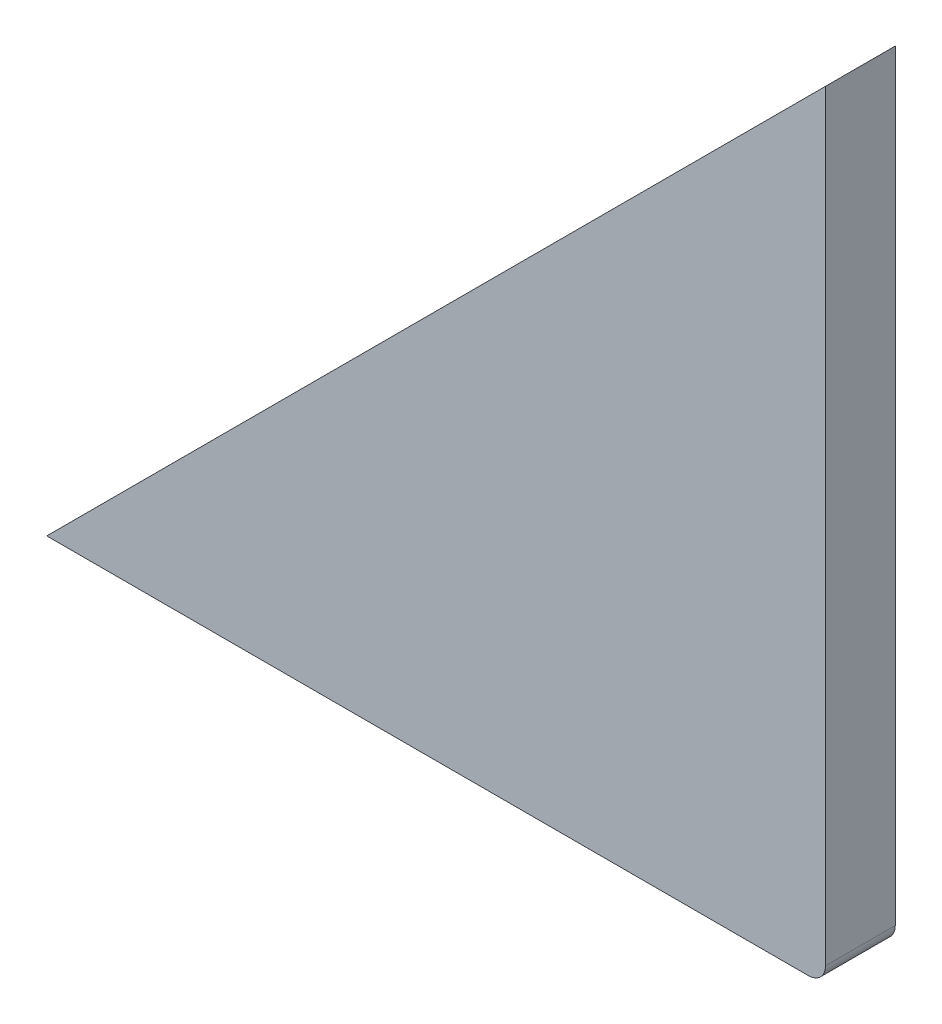
ISO-10303-21;
HEADER;
FILE_DESCRIPTION(('STEP AP214'),'2;1');
FILE_NAME('part.step','',(''),(''),'','','');
FILE_SCHEMA(('AUTOMOTIVE_DESIGN { 1 0 10303 214 1 1 1 1 }'));
ENDSEC;
DATA;
#1=APPLICATION_CONTEXT('core data for automotive mechanical design processes');
#2=APPLICATION_PROTOCOL_DEFINITION('international standard','automotive_design',2000,#1);
#3=PRODUCT_CONTEXT('',#1,'mechanical');
#4=PRODUCT('Part','Part','',(#3));
#5=PRODUCT_RELATED_PRODUCT_CATEGORY('part','',(#4));
#6=PRODUCT_DEFINITION_FORMATION('','',#4);
#7=PRODUCT_DEFINITION_CONTEXT('part definition',#1,'design');
#8=PRODUCT_DEFINITION('design','',#6,#7);
#9=PRODUCT_DEFINITION_SHAPE('','',#8);
#10=(LENGTH_UNIT() NAMED_UNIT(*) SI_UNIT(.MILLI.,.METRE.));
#11=(NAMED_UNIT(*) PLANE_ANGLE_UNIT() SI_UNIT($,.RADIAN.));
#12=(NAMED_UNIT(*) SI_UNIT($,.STERADIAN.) SOLID_ANGLE_UNIT());
#13=UNCERTAINTY_MEASURE_WITH_UNIT(LENGTH_MEASURE(1.E-05),#10,'distance_accuracy_value','');
#14=(GEOMETRIC_REPRESENTATION_CONTEXT(3) GLOBAL_UNCERTAINTY_ASSIGNED_CONTEXT((#13)) GLOBAL_UNIT_ASSIGNED_CONTEXT((#10,
#11,#12)) REPRESENTATION_CONTEXT('',''));
#15=CARTESIAN_POINT('',(0.,0.,0.));
#16=DIRECTION('',(0.,0.,1.));
#17=DIRECTION('',(1.,0.,0.));
#18=AXIS2_PLACEMENT_3D('',#15,#16,#17);
#19=CARTESIAN_POINT('',(-80.4999999999999,47.100921455939,10.3334090822726));
#20=DIRECTION('',(0.707106781186546,-0.707106781186548,0.));
#21=DIRECTION('',(0.707106781186549,0.707106781186546,0.));
#22=AXIS2_PLACEMENT_3D('',#19,#20,#21);
#23=PLANE('',#22);
#24=DIRECTION('',(-0.707106781186549,-0.707106781186546,0.));
#25=VECTOR('',#24,1.);
#26=CARTESIAN_POINT('',(-80.4999999999999,47.100921455939,7.33340908227261));
#27=LINE('',#26,#25);
#28=CARTESIAN_POINT('',(-80.4999999999999,47.100921455939,7.33340908227261));
#29=VERTEX_POINT('',#28);
#30=CARTESIAN_POINT('',(-114.,13.600921455939,7.33340908227261));
#31=VERTEX_POINT('',#30);
#32=EDGE_CURVE('E109',#29,#31,#27,.T.);
#33=ORIENTED_EDGE('',*,*,#32,.T.);
#34=DIRECTION('',(0.,0.,-1.));
#35=VECTOR('',#34,1.);
#36=CARTESIAN_POINT('',(-114.,13.600921455939,10.3334090822726));
#37=LINE('',#36,#35);
#38=CARTESIAN_POINT('',(-114.,13.600921455939,10.3334090822726));
#39=VERTEX_POINT('',#38);
#40=EDGE_CURVE('E11',#39,#31,#37,.T.);
#41=ORIENTED_EDGE('',*,*,#40,.F.);
#42=DIRECTION('',(-0.707106781186549,-0.707106781186546,0.));
#43=VECTOR('',#42,1.);
#44=CARTESIAN_POINT('',(-80.4999999999999,47.100921455939,10.3334090822726));
#45=LINE('',#44,#43);
#46=CARTESIAN_POINT('',(-80.4999999999999,47.100921455939,10.3334090822726));
#47=VERTEX_POINT('',#46);
#48=EDGE_CURVE('E93',#47,#39,#45,.T.);
#49=ORIENTED_EDGE('',*,*,#48,.F.);
#50=DIRECTION('',(0.,0.,-1.));
#51=VECTOR('',#50,1.);
#52=CARTESIAN_POINT('',(-80.4999999999999,47.100921455939,10.3334090822726));
#53=LINE('',#52,#51);
#54=EDGE_CURVE('E105',#47,#29,#53,.T.);
#55=ORIENTED_EDGE('',*,*,#54,.T.);
#56=EDGE_LOOP('',(#33,#41,#49,#55));
#57=FACE_BOUND('',#56,.T.);
#58=ADVANCED_FACE('F41',(#57),#23,.F.);
#59=CARTESIAN_POINT('',(-114.,13.600921455939,10.3334090822726));
#60=DIRECTION('',(0.,1.,0.));
#61=DIRECTION('',(-1.,0.,0.));
#62=AXIS2_PLACEMENT_3D('',#59,#60,#61);
#63=PLANE('',#62);
#64=DIRECTION('',(1.,0.,0.));
#65=VECTOR('',#64,1.);
#66=CARTESIAN_POINT('',(-114.,13.600921455939,7.33340908227261));
#67=LINE('',#66,#65);
#68=CARTESIAN_POINT('',(-81.2366,13.600921455939,7.33340908227261));
#69=VERTEX_POINT('',#68);
#70=EDGE_CURVE('E98',#31,#69,#67,.T.);
#71=ORIENTED_EDGE('',*,*,#70,.T.);
#72=DIRECTION('',(0.,0.,-1.));
#73=VECTOR('',#72,1.);
#74=CARTESIAN_POINT('',(-81.2366,13.600921455939,10.3334090822726));
#75=LINE('',#74,#73);
#76=CARTESIAN_POINT('',(-81.2366,13.600921455939,10.3334090822726));
#77=VERTEX_POINT('',#76);
#78=EDGE_CURVE('E50',#77,#69,#75,.T.);
#79=ORIENTED_EDGE('',*,*,#78,.F.);
#80=DIRECTION('',(1.,0.,0.));
#81=VECTOR('',#80,1.);
#82=CARTESIAN_POINT('',(-114.,13.600921455939,10.3334090822726));
#83=LINE('',#82,#81);
#84=EDGE_CURVE('E88',#39,#77,#83,.T.);
#85=ORIENTED_EDGE('',*,*,#84,.F.);
#86=ORIENTED_EDGE('',*,*,#40,.T.);
#87=EDGE_LOOP('',(#71,#79,#85,#86));
#88=FACE_BOUND('',#87,.T.);
#89=ADVANCED_FACE('F97',(#88),#63,.F.);
#90=CARTESIAN_POINT('',(-81.2366,14.337521455939,10.3334090822726));
#91=DIRECTION('',(0.,0.,-1.));
#92=DIRECTION('',(-1.,0.,0.));
#93=AXIS2_PLACEMENT_3D('',#90,#91,#92);
#94=CYLINDRICAL_SURFACE('',#93,0.736600000000004);
#95=CARTESIAN_POINT('',(-81.2366,14.337521455939,7.33340908227261));
#96=DIRECTION('',(0.,0.,1.));
#97=DIRECTION('',(1.,0.,0.));
#98=AXIS2_PLACEMENT_3D('',#95,#96,#97);
#99=CIRCLE('',#98,0.736600000000004);
#100=CARTESIAN_POINT('',(-80.5,14.337521455939,7.33340908227261));
#101=VERTEX_POINT('',#100);
#102=EDGE_CURVE('E75',#69,#101,#99,.T.);
#103=ORIENTED_EDGE('',*,*,#102,.T.);
#104=DIRECTION('',(0.,0.,-1.));
#105=VECTOR('',#104,1.);
#106=CARTESIAN_POINT('',(-80.5,14.337521455939,10.3334090822726));
#107=LINE('',#106,#105);
#108=CARTESIAN_POINT('',(-80.5,14.337521455939,10.3334090822726));
#109=VERTEX_POINT('',#108);
#110=EDGE_CURVE('E100',#109,#101,#107,.T.);
#111=ORIENTED_EDGE('',*,*,#110,.F.);
#112=CARTESIAN_POINT('',(-81.2366,14.337521455939,10.3334090822726));
#113=DIRECTION('',(0.,0.,1.));
#114=DIRECTION('',(1.,0.,0.));
#115=AXIS2_PLACEMENT_3D('',#112,#113,#114);
#116=CIRCLE('',#115,0.736600000000004);
#117=EDGE_CURVE('E91',#77,#109,#116,.T.);
#118=ORIENTED_EDGE('',*,*,#117,.F.);
#119=ORIENTED_EDGE('',*,*,#78,.T.);
#120=EDGE_LOOP('',(#103,#111,#118,#119));
#121=FACE_BOUND('',#120,.T.);
#122=ADVANCED_FACE('F101',(#121),#94,.T.);
#123=CARTESIAN_POINT('',(-80.4999999999999,47.100921455939,10.3334090822726));
#124=DIRECTION('',(-1.,0.,0.));
#125=DIRECTION('',(0.,-1.,0.));
#126=AXIS2_PLACEMENT_3D('',#123,#124,#125);
#127=PLANE('',#126);
#128=DIRECTION('',(0.,1.,0.));
#129=VECTOR('',#128,1.);
#130=CARTESIAN_POINT('',(-80.4999999999999,47.100921455939,7.33340908227261));
#131=LINE('',#130,#129);
#132=EDGE_CURVE('E81',#101,#29,#131,.T.);
#133=ORIENTED_EDGE('',*,*,#132,.T.);
#134=ORIENTED_EDGE('',*,*,#54,.F.);
#135=DIRECTION('',(0.,1.,0.));
#136=VECTOR('',#135,1.);
#137=CARTESIAN_POINT('',(-80.4999999999999,47.100921455939,10.3334090822726));
#138=LINE('',#137,#136);
#139=EDGE_CURVE('E58',#109,#47,#138,.T.);
#140=ORIENTED_EDGE('',*,*,#139,.F.);
#141=ORIENTED_EDGE('',*,*,#110,.T.);
#142=EDGE_LOOP('',(#133,#134,#140,#141));
#143=FACE_BOUND('',#142,.T.);
#144=ADVANCED_FACE('F122',(#143),#127,.F.);
#145=CARTESIAN_POINT('',(-81.2366,14.337521455939,10.3334090822726));
#146=DIRECTION('',(0.,0.,1.));
#147=DIRECTION('',(1.,0.,0.));
#148=AXIS2_PLACEMENT_3D('',#145,#146,#147);
#149=PLANE('',#148);
#150=ORIENTED_EDGE('',*,*,#48,.T.);
#151=ORIENTED_EDGE('',*,*,#84,.T.);
#152=ORIENTED_EDGE('',*,*,#117,.T.);
#153=ORIENTED_EDGE('',*,*,#139,.T.);
#154=EDGE_LOOP('',(#150,#151,#152,#153));
#155=FACE_BOUND('',#154,.T.);
#156=ADVANCED_FACE('F89',(#155),#149,.T.);
#157=CARTESIAN_POINT('',(-81.2366,14.337521455939,7.33340908227261));
#158=DIRECTION('',(0.,0.,1.));
#159=DIRECTION('',(1.,0.,0.));
#160=AXIS2_PLACEMENT_3D('',#157,#158,#159);
#161=PLANE('',#160);
#162=ORIENTED_EDGE('',*,*,#32,.F.);
#163=ORIENTED_EDGE('',*,*,#132,.F.);
#164=ORIENTED_EDGE('',*,*,#102,.F.);
#165=ORIENTED_EDGE('',*,*,#70,.F.);
#166=EDGE_LOOP('',(#162,#163,#164,#165));
#167=FACE_BOUND('',#166,.T.);
#168=ADVANCED_FACE('F125',(#167),#161,.F.);
#169=CLOSED_SHELL('',(#58,#89,#122,#144,#156,#168));
#170=MANIFOLD_SOLID_BREP('B2',#169);
#171=ADVANCED_BREP_SHAPE_REPRESENTATION('',(#18,#170),#14);
#172=SHAPE_DEFINITION_REPRESENTATION(#9,#171);
ENDSEC;
END-ISO-10303-21;
